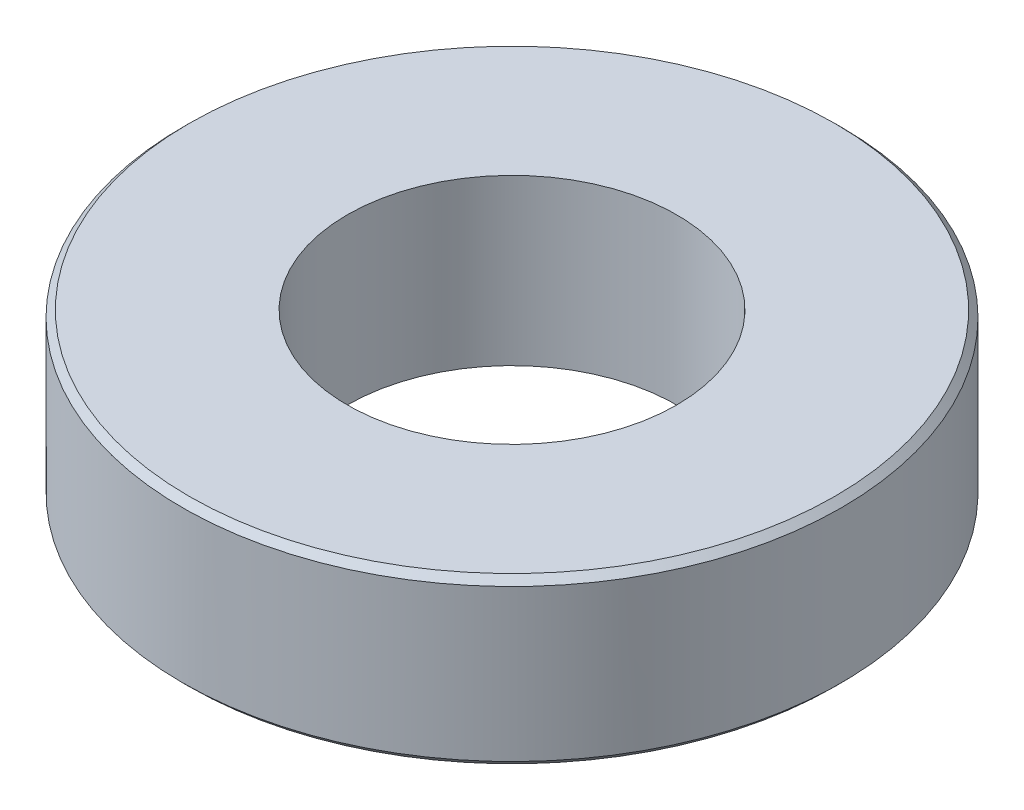
ISO-10303-21;
HEADER;
FILE_DESCRIPTION(('STEP AP214'),'2;1');
FILE_NAME('part.step','',(''),(''),'','','');
FILE_SCHEMA(('AUTOMOTIVE_DESIGN { 1 0 10303 214 1 1 1 1 }'));
ENDSEC;
DATA;
#1=APPLICATION_CONTEXT('core data for automotive mechanical design processes');
#2=APPLICATION_PROTOCOL_DEFINITION('international standard','automotive_design',2000,#1);
#3=PRODUCT_CONTEXT('',#1,'mechanical');
#4=PRODUCT('Part','Part','',(#3));
#5=PRODUCT_RELATED_PRODUCT_CATEGORY('part','',(#4));
#6=PRODUCT_DEFINITION_FORMATION('','',#4);
#7=PRODUCT_DEFINITION_CONTEXT('part definition',#1,'design');
#8=PRODUCT_DEFINITION('design','',#6,#7);
#9=PRODUCT_DEFINITION_SHAPE('','',#8);
#10=(LENGTH_UNIT() NAMED_UNIT(*) SI_UNIT(.MILLI.,.METRE.));
#11=(NAMED_UNIT(*) PLANE_ANGLE_UNIT() SI_UNIT($,.RADIAN.));
#12=(NAMED_UNIT(*) SI_UNIT($,.STERADIAN.) SOLID_ANGLE_UNIT());
#13=UNCERTAINTY_MEASURE_WITH_UNIT(LENGTH_MEASURE(1.E-05),#10,'distance_accuracy_value','');
#14=(GEOMETRIC_REPRESENTATION_CONTEXT(3) GLOBAL_UNCERTAINTY_ASSIGNED_CONTEXT((#13)) GLOBAL_UNIT_ASSIGNED_CONTEXT((#10,
#11,#12)) REPRESENTATION_CONTEXT('',''));
#15=CARTESIAN_POINT('',(0.,0.,0.));
#16=DIRECTION('',(0.,0.,1.));
#17=DIRECTION('',(1.,0.,0.));
#18=AXIS2_PLACEMENT_3D('',#15,#16,#17);
#19=CARTESIAN_POINT('',(-9.9176,0.,-9.9176));
#20=DIRECTION('',(0.,1.,0.));
#21=DIRECTION('',(0.,0.,1.));
#22=AXIS2_PLACEMENT_3D('',#19,#20,#21);
#23=PLANE('',#22);
#24=CARTESIAN_POINT('',(0.,0.,0.));
#25=DIRECTION('',(0.,-1.,0.));
#26=DIRECTION('',(1.,0.,0.));
#27=AXIS2_PLACEMENT_3D('',#24,#25,#26);
#28=CIRCLE('',#27,5.);
#29=CARTESIAN_POINT('',(5.,0.,0.));
#30=VERTEX_POINT('',#29);
#31=EDGE_CURVE('E32',#30,#30,#28,.T.);
#32=ORIENTED_EDGE('',*,*,#31,.F.);
#33=EDGE_LOOP('',(#32));
#34=FACE_BOUND('',#33,.T.);
#35=CARTESIAN_POINT('',(0.,0.,0.));
#36=DIRECTION('',(0.,1.,0.));
#37=DIRECTION('',(0.,0.,1.));
#38=AXIS2_PLACEMENT_3D('',#35,#36,#37);
#39=CIRCLE('',#38,9.8);
#40=CARTESIAN_POINT('',(0.,0.,9.8));
#41=VERTEX_POINT('',#40);
#42=EDGE_CURVE('E17',#41,#41,#39,.F.);
#43=ORIENTED_EDGE('',*,*,#42,.T.);
#44=EDGE_LOOP('',(#43));
#45=FACE_BOUND('',#44,.T.);
#46=ADVANCED_FACE('F13',(#34,#45),#23,.F.);
#47=CARTESIAN_POINT('',(0.,0.,0.));
#48=DIRECTION('',(0.,1.,0.));
#49=DIRECTION('',(0.,0.,1.));
#50=AXIS2_PLACEMENT_3D('',#47,#48,#49);
#51=CONICAL_SURFACE('',#50,9.8,0.785398163397445);
#52=CARTESIAN_POINT('',(0.,0.2,0.));
#53=DIRECTION('',(0.,-1.,0.));
#54=DIRECTION('',(0.,0.,-1.));
#55=AXIS2_PLACEMENT_3D('',#52,#53,#54);
#56=CIRCLE('',#55,10.);
#57=CARTESIAN_POINT('',(0.,0.2,-10.));
#58=VERTEX_POINT('',#57);
#59=EDGE_CURVE('E30',#58,#58,#56,.T.);
#60=ORIENTED_EDGE('',*,*,#59,.T.);
#61=EDGE_LOOP('',(#60));
#62=FACE_BOUND('',#61,.T.);
#63=ORIENTED_EDGE('',*,*,#42,.F.);
#64=EDGE_LOOP('',(#63));
#65=FACE_BOUND('',#64,.T.);
#66=ADVANCED_FACE('F41',(#62,#65),#51,.T.);
#67=CARTESIAN_POINT('',(0.,5.,0.));
#68=DIRECTION('',(0.,-1.,0.));
#69=DIRECTION('',(1.,0.,0.));
#70=AXIS2_PLACEMENT_3D('',#67,#68,#69);
#71=CYLINDRICAL_SURFACE('',#70,5.);
#72=CARTESIAN_POINT('',(0.,5.,0.));
#73=DIRECTION('',(0.,-1.,0.));
#74=DIRECTION('',(1.,0.,0.));
#75=AXIS2_PLACEMENT_3D('',#72,#73,#74);
#76=CIRCLE('',#75,5.);
#77=CARTESIAN_POINT('',(5.,5.,0.));
#78=VERTEX_POINT('',#77);
#79=EDGE_CURVE('E26',#78,#78,#76,.T.);
#80=ORIENTED_EDGE('',*,*,#79,.F.);
#81=EDGE_LOOP('',(#80));
#82=FACE_BOUND('',#81,.T.);
#83=ORIENTED_EDGE('',*,*,#31,.T.);
#84=EDGE_LOOP('',(#83));
#85=FACE_BOUND('',#84,.T.);
#86=ADVANCED_FACE('F43',(#82,#85),#71,.F.);
#87=CARTESIAN_POINT('',(0.,4.8,0.));
#88=DIRECTION('',(0.,-1.,0.));
#89=DIRECTION('',(0.,0.,-1.));
#90=AXIS2_PLACEMENT_3D('',#87,#88,#89);
#91=CYLINDRICAL_SURFACE('',#90,10.);
#92=ORIENTED_EDGE('',*,*,#59,.F.);
#93=EDGE_LOOP('',(#92));
#94=FACE_BOUND('',#93,.T.);
#95=CARTESIAN_POINT('',(0.,4.79999999999992,0.));
#96=DIRECTION('',(0.,-1.,0.));
#97=DIRECTION('',(0.,0.,-1.));
#98=AXIS2_PLACEMENT_3D('',#95,#96,#97);
#99=CIRCLE('',#98,10.);
#100=CARTESIAN_POINT('',(0.,4.8,-10.));
#101=VERTEX_POINT('',#100);
#102=EDGE_CURVE('E21',#101,#101,#99,.T.);
#103=ORIENTED_EDGE('',*,*,#102,.T.);
#104=EDGE_LOOP('',(#103));
#105=FACE_BOUND('',#104,.T.);
#106=ADVANCED_FACE('F51',(#94,#105),#91,.T.);
#107=CARTESIAN_POINT('',(-9.9176,5.,-9.9176));
#108=DIRECTION('',(0.,1.,0.));
#109=DIRECTION('',(0.,0.,1.));
#110=AXIS2_PLACEMENT_3D('',#107,#108,#109);
#111=PLANE('',#110);
#112=ORIENTED_EDGE('',*,*,#79,.T.);
#113=EDGE_LOOP('',(#112));
#114=FACE_BOUND('',#113,.T.);
#115=CARTESIAN_POINT('',(0.,4.99999999999989,0.));
#116=DIRECTION('',(0.,-1.,0.));
#117=DIRECTION('',(1.,0.,0.));
#118=AXIS2_PLACEMENT_3D('',#115,#116,#117);
#119=CIRCLE('',#118,9.80000000000011);
#120=CARTESIAN_POINT('',(9.80000000000011,4.99999999999989,0.));
#121=VERTEX_POINT('',#120);
#122=EDGE_CURVE('E9',#121,#121,#119,.F.);
#123=ORIENTED_EDGE('',*,*,#122,.T.);
#124=EDGE_LOOP('',(#123));
#125=FACE_BOUND('',#124,.T.);
#126=ADVANCED_FACE('F15',(#114,#125),#111,.T.);
#127=CARTESIAN_POINT('',(0.,5.,0.));
#128=DIRECTION('',(0.,-1.,0.));
#129=DIRECTION('',(1.,0.,0.));
#130=AXIS2_PLACEMENT_3D('',#127,#128,#129);
#131=CONICAL_SURFACE('',#130,9.8,0.785398163397444);
#132=ORIENTED_EDGE('',*,*,#122,.F.);
#133=EDGE_LOOP('',(#132));
#134=FACE_BOUND('',#133,.T.);
#135=ORIENTED_EDGE('',*,*,#102,.F.);
#136=EDGE_LOOP('',(#135));
#137=FACE_BOUND('',#136,.T.);
#138=ADVANCED_FACE('F55',(#134,#137),#131,.T.);
#139=CLOSED_SHELL('',(#46,#66,#86,#106,#126,#138));
#140=MANIFOLD_SOLID_BREP('B1',#139);
#141=ADVANCED_BREP_SHAPE_REPRESENTATION('',(#18,#140),#14);
#142=SHAPE_DEFINITION_REPRESENTATION(#9,#141);
ENDSEC;
END-ISO-10303-21;
